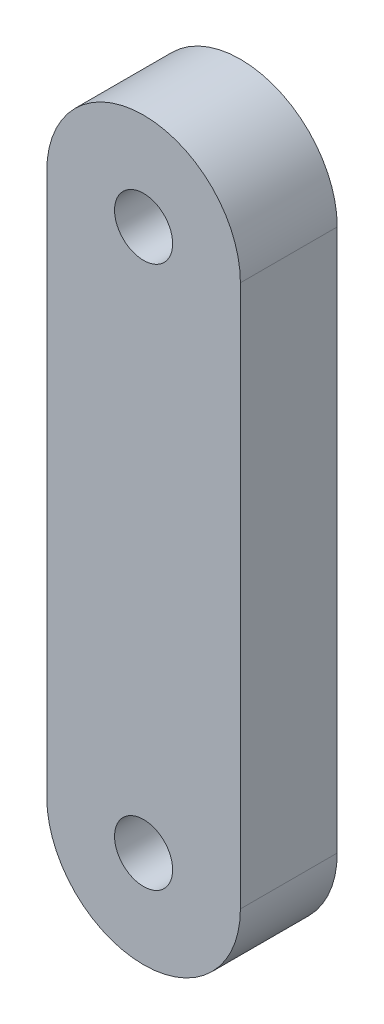
ISO-10303-21;
HEADER;
FILE_DESCRIPTION(('STEP AP214'),'2;1');
FILE_NAME('part.step','',(''),(''),'','','');
FILE_SCHEMA(('AUTOMOTIVE_DESIGN { 1 0 10303 214 1 1 1 1 }'));
ENDSEC;
DATA;
#1=APPLICATION_CONTEXT('core data for automotive mechanical design processes');
#2=APPLICATION_PROTOCOL_DEFINITION('international standard','automotive_design',2000,#1);
#3=PRODUCT_CONTEXT('',#1,'mechanical');
#4=PRODUCT('Part','Part','',(#3));
#5=PRODUCT_RELATED_PRODUCT_CATEGORY('part','',(#4));
#6=PRODUCT_DEFINITION_FORMATION('','',#4);
#7=PRODUCT_DEFINITION_CONTEXT('part definition',#1,'design');
#8=PRODUCT_DEFINITION('design','',#6,#7);
#9=PRODUCT_DEFINITION_SHAPE('','',#8);
#10=(LENGTH_UNIT() NAMED_UNIT(*) SI_UNIT(.MILLI.,.METRE.));
#11=(NAMED_UNIT(*) PLANE_ANGLE_UNIT() SI_UNIT($,.RADIAN.));
#12=(NAMED_UNIT(*) SI_UNIT($,.STERADIAN.) SOLID_ANGLE_UNIT());
#13=UNCERTAINTY_MEASURE_WITH_UNIT(LENGTH_MEASURE(1.E-05),#10,'distance_accuracy_value','');
#14=(GEOMETRIC_REPRESENTATION_CONTEXT(3) GLOBAL_UNCERTAINTY_ASSIGNED_CONTEXT((#13)) GLOBAL_UNIT_ASSIGNED_CONTEXT((#10,
#11,#12)) REPRESENTATION_CONTEXT('',''));
#15=CARTESIAN_POINT('',(0.,0.,0.));
#16=DIRECTION('',(0.,0.,1.));
#17=DIRECTION('',(1.,0.,0.));
#18=AXIS2_PLACEMENT_3D('',#15,#16,#17);
#19=CARTESIAN_POINT('',(0.,0.,5.));
#20=DIRECTION('',(0.,0.,1.));
#21=DIRECTION('',(1.,0.,0.));
#22=AXIS2_PLACEMENT_3D('',#19,#20,#21);
#23=PLANE('',#22);
#24=CARTESIAN_POINT('',(0.,0.,5.));
#25=DIRECTION('',(0.,0.,1.));
#26=DIRECTION('',(1.,0.,0.));
#27=AXIS2_PLACEMENT_3D('',#24,#25,#26);
#28=CIRCLE('',#27,1.5);
#29=CARTESIAN_POINT('',(1.5,0.,5.));
#30=VERTEX_POINT('',#29);
#31=EDGE_CURVE('E100',#30,#30,#28,.T.);
#32=ORIENTED_EDGE('',*,*,#31,.F.);
#33=EDGE_LOOP('',(#32));
#34=FACE_BOUND('',#33,.T.);
#35=CARTESIAN_POINT('',(0.,0.,5.));
#36=DIRECTION('',(0.,0.,1.));
#37=DIRECTION('',(1.,0.,0.));
#38=AXIS2_PLACEMENT_3D('',#35,#36,#37);
#39=CIRCLE('',#38,5.);
#40=CARTESIAN_POINT('',(-5.,0.,5.));
#41=VERTEX_POINT('',#40);
#42=CARTESIAN_POINT('',(5.,0.,5.));
#43=VERTEX_POINT('',#42);
#44=EDGE_CURVE('E85',#41,#43,#39,.T.);
#45=ORIENTED_EDGE('',*,*,#44,.T.);
#46=DIRECTION('',(0.,1.,0.));
#47=VECTOR('',#46,1.);
#48=CARTESIAN_POINT('',(5.,0.,5.));
#49=LINE('',#48,#47);
#50=CARTESIAN_POINT('',(5.,28.,5.));
#51=VERTEX_POINT('',#50);
#52=EDGE_CURVE('E80',#43,#51,#49,.T.);
#53=ORIENTED_EDGE('',*,*,#52,.T.);
#54=CARTESIAN_POINT('',(0.,28.,5.));
#55=DIRECTION('',(0.,0.,1.));
#56=DIRECTION('',(1.,0.,0.));
#57=AXIS2_PLACEMENT_3D('',#54,#55,#56);
#58=CIRCLE('',#57,5.);
#59=CARTESIAN_POINT('',(-5.,28.,5.));
#60=VERTEX_POINT('',#59);
#61=EDGE_CURVE('E83',#51,#60,#58,.T.);
#62=ORIENTED_EDGE('',*,*,#61,.T.);
#63=DIRECTION('',(0.,-1.,0.));
#64=VECTOR('',#63,1.);
#65=CARTESIAN_POINT('',(-5.,0.,5.));
#66=LINE('',#65,#64);
#67=EDGE_CURVE('E50',#60,#41,#66,.T.);
#68=ORIENTED_EDGE('',*,*,#67,.T.);
#69=EDGE_LOOP('',(#45,#53,#62,#68));
#70=FACE_BOUND('',#69,.T.);
#71=CARTESIAN_POINT('',(0.,28.,5.));
#72=DIRECTION('',(0.,0.,1.));
#73=DIRECTION('',(1.,0.,0.));
#74=AXIS2_PLACEMENT_3D('',#71,#72,#73);
#75=CIRCLE('',#74,1.5);
#76=CARTESIAN_POINT('',(1.5,28.,5.));
#77=VERTEX_POINT('',#76);
#78=EDGE_CURVE('E115',#77,#77,#75,.T.);
#79=ORIENTED_EDGE('',*,*,#78,.F.);
#80=EDGE_LOOP('',(#79));
#81=FACE_BOUND('',#80,.T.);
#82=ADVANCED_FACE('F33',(#34,#70,#81),#23,.T.);
#83=CARTESIAN_POINT('',(0.,0.,0.));
#84=DIRECTION('',(0.,0.,1.));
#85=DIRECTION('',(1.,0.,0.));
#86=AXIS2_PLACEMENT_3D('',#83,#84,#85);
#87=PLANE('',#86);
#88=CARTESIAN_POINT('',(0.,0.,0.));
#89=DIRECTION('',(0.,0.,1.));
#90=DIRECTION('',(1.,0.,0.));
#91=AXIS2_PLACEMENT_3D('',#88,#89,#90);
#92=CIRCLE('',#91,1.5);
#93=CARTESIAN_POINT('',(1.5,0.,0.));
#94=VERTEX_POINT('',#93);
#95=EDGE_CURVE('E112',#94,#94,#92,.T.);
#96=ORIENTED_EDGE('',*,*,#95,.T.);
#97=EDGE_LOOP('',(#96));
#98=FACE_BOUND('',#97,.T.);
#99=CARTESIAN_POINT('',(0.,0.,0.));
#100=DIRECTION('',(0.,0.,1.));
#101=DIRECTION('',(1.,0.,0.));
#102=AXIS2_PLACEMENT_3D('',#99,#100,#101);
#103=CIRCLE('',#102,5.);
#104=CARTESIAN_POINT('',(-5.,0.,0.));
#105=VERTEX_POINT('',#104);
#106=CARTESIAN_POINT('',(5.,0.,0.));
#107=VERTEX_POINT('',#106);
#108=EDGE_CURVE('E97',#105,#107,#103,.T.);
#109=ORIENTED_EDGE('',*,*,#108,.F.);
#110=DIRECTION('',(0.,-1.,0.));
#111=VECTOR('',#110,1.);
#112=CARTESIAN_POINT('',(-5.,0.,0.));
#113=LINE('',#112,#111);
#114=CARTESIAN_POINT('',(-5.,28.,0.));
#115=VERTEX_POINT('',#114);
#116=EDGE_CURVE('E73',#115,#105,#113,.T.);
#117=ORIENTED_EDGE('',*,*,#116,.F.);
#118=CARTESIAN_POINT('',(0.,28.,0.));
#119=DIRECTION('',(0.,0.,1.));
#120=DIRECTION('',(1.,0.,0.));
#121=AXIS2_PLACEMENT_3D('',#118,#119,#120);
#122=CIRCLE('',#121,5.);
#123=CARTESIAN_POINT('',(5.,28.,0.));
#124=VERTEX_POINT('',#123);
#125=EDGE_CURVE('E67',#124,#115,#122,.T.);
#126=ORIENTED_EDGE('',*,*,#125,.F.);
#127=DIRECTION('',(0.,1.,0.));
#128=VECTOR('',#127,1.);
#129=CARTESIAN_POINT('',(5.,0.,0.));
#130=LINE('',#129,#128);
#131=EDGE_CURVE('E89',#107,#124,#130,.T.);
#132=ORIENTED_EDGE('',*,*,#131,.F.);
#133=EDGE_LOOP('',(#109,#117,#126,#132));
#134=FACE_BOUND('',#133,.T.);
#135=CARTESIAN_POINT('',(0.,28.,0.));
#136=DIRECTION('',(0.,0.,1.));
#137=DIRECTION('',(1.,0.,0.));
#138=AXIS2_PLACEMENT_3D('',#135,#136,#137);
#139=CIRCLE('',#138,1.5);
#140=CARTESIAN_POINT('',(1.5,28.,0.));
#141=VERTEX_POINT('',#140);
#142=EDGE_CURVE('E118',#141,#141,#139,.T.);
#143=ORIENTED_EDGE('',*,*,#142,.T.);
#144=EDGE_LOOP('',(#143));
#145=FACE_BOUND('',#144,.T.);
#146=ADVANCED_FACE('F108',(#98,#134,#145),#87,.F.);
#147=CARTESIAN_POINT('',(0.,0.,5.));
#148=DIRECTION('',(0.,0.,-1.));
#149=DIRECTION('',(-1.,0.,0.));
#150=AXIS2_PLACEMENT_3D('',#147,#148,#149);
#151=CYLINDRICAL_SURFACE('',#150,5.);
#152=ORIENTED_EDGE('',*,*,#108,.T.);
#153=DIRECTION('',(0.,0.,-1.));
#154=VECTOR('',#153,1.);
#155=CARTESIAN_POINT('',(5.,0.,5.));
#156=LINE('',#155,#154);
#157=EDGE_CURVE('E11',#43,#107,#156,.T.);
#158=ORIENTED_EDGE('',*,*,#157,.F.);
#159=ORIENTED_EDGE('',*,*,#44,.F.);
#160=DIRECTION('',(0.,0.,-1.));
#161=VECTOR('',#160,1.);
#162=CARTESIAN_POINT('',(-5.,0.,5.));
#163=LINE('',#162,#161);
#164=EDGE_CURVE('E93',#41,#105,#163,.T.);
#165=ORIENTED_EDGE('',*,*,#164,.T.);
#166=EDGE_LOOP('',(#152,#158,#159,#165));
#167=FACE_BOUND('',#166,.T.);
#168=ADVANCED_FACE('F35',(#167),#151,.T.);
#169=CARTESIAN_POINT('',(5.,0.,5.));
#170=DIRECTION('',(-1.,0.,0.));
#171=DIRECTION('',(0.,0.,1.));
#172=AXIS2_PLACEMENT_3D('',#169,#170,#171);
#173=PLANE('',#172);
#174=ORIENTED_EDGE('',*,*,#131,.T.);
#175=DIRECTION('',(0.,0.,-1.));
#176=VECTOR('',#175,1.);
#177=CARTESIAN_POINT('',(5.,28.,5.));
#178=LINE('',#177,#176);
#179=EDGE_CURVE('E42',#51,#124,#178,.T.);
#180=ORIENTED_EDGE('',*,*,#179,.F.);
#181=ORIENTED_EDGE('',*,*,#52,.F.);
#182=ORIENTED_EDGE('',*,*,#157,.T.);
#183=EDGE_LOOP('',(#174,#180,#181,#182));
#184=FACE_BOUND('',#183,.T.);
#185=ADVANCED_FACE('F88',(#184),#173,.F.);
#186=CARTESIAN_POINT('',(0.,28.,5.));
#187=DIRECTION('',(0.,0.,-1.));
#188=DIRECTION('',(-1.,0.,0.));
#189=AXIS2_PLACEMENT_3D('',#186,#187,#188);
#190=CYLINDRICAL_SURFACE('',#189,5.);
#191=ORIENTED_EDGE('',*,*,#125,.T.);
#192=DIRECTION('',(0.,0.,-1.));
#193=VECTOR('',#192,1.);
#194=CARTESIAN_POINT('',(-5.,28.,5.));
#195=LINE('',#194,#193);
#196=EDGE_CURVE('E90',#60,#115,#195,.T.);
#197=ORIENTED_EDGE('',*,*,#196,.F.);
#198=ORIENTED_EDGE('',*,*,#61,.F.);
#199=ORIENTED_EDGE('',*,*,#179,.T.);
#200=EDGE_LOOP('',(#191,#197,#198,#199));
#201=FACE_BOUND('',#200,.T.);
#202=ADVANCED_FACE('F91',(#201),#190,.T.);
#203=CARTESIAN_POINT('',(-5.,0.,5.));
#204=DIRECTION('',(1.,0.,0.));
#205=DIRECTION('',(0.,0.,-1.));
#206=AXIS2_PLACEMENT_3D('',#203,#204,#205);
#207=PLANE('',#206);
#208=ORIENTED_EDGE('',*,*,#116,.T.);
#209=ORIENTED_EDGE('',*,*,#164,.F.);
#210=ORIENTED_EDGE('',*,*,#67,.F.);
#211=ORIENTED_EDGE('',*,*,#196,.T.);
#212=EDGE_LOOP('',(#208,#209,#210,#211));
#213=FACE_BOUND('',#212,.T.);
#214=ADVANCED_FACE('F105',(#213),#207,.F.);
#215=CARTESIAN_POINT('',(0.,0.,5.));
#216=DIRECTION('',(0.,0.,-1.));
#217=DIRECTION('',(-1.,0.,0.));
#218=AXIS2_PLACEMENT_3D('',#215,#216,#217);
#219=CYLINDRICAL_SURFACE('',#218,1.5);
#220=ORIENTED_EDGE('',*,*,#31,.T.);
#221=EDGE_LOOP('',(#220));
#222=FACE_BOUND('',#221,.T.);
#223=ORIENTED_EDGE('',*,*,#95,.F.);
#224=EDGE_LOOP('',(#223));
#225=FACE_BOUND('',#224,.T.);
#226=ADVANCED_FACE('F136',(#222,#225),#219,.F.);
#227=CARTESIAN_POINT('',(0.,28.,5.));
#228=DIRECTION('',(0.,0.,-1.));
#229=DIRECTION('',(-1.,0.,0.));
#230=AXIS2_PLACEMENT_3D('',#227,#228,#229);
#231=CYLINDRICAL_SURFACE('',#230,1.5);
#232=ORIENTED_EDGE('',*,*,#78,.T.);
#233=EDGE_LOOP('',(#232));
#234=FACE_BOUND('',#233,.T.);
#235=ORIENTED_EDGE('',*,*,#142,.F.);
#236=EDGE_LOOP('',(#235));
#237=FACE_BOUND('',#236,.T.);
#238=ADVANCED_FACE('F124',(#234,#237),#231,.F.);
#239=CLOSED_SHELL('',(#82,#146,#168,#185,#202,#214,#226,#238));
#240=MANIFOLD_SOLID_BREP('B2',#239);
#241=ADVANCED_BREP_SHAPE_REPRESENTATION('',(#18,#240),#14);
#242=SHAPE_DEFINITION_REPRESENTATION(#9,#241);
ENDSEC;
END-ISO-10303-21;
